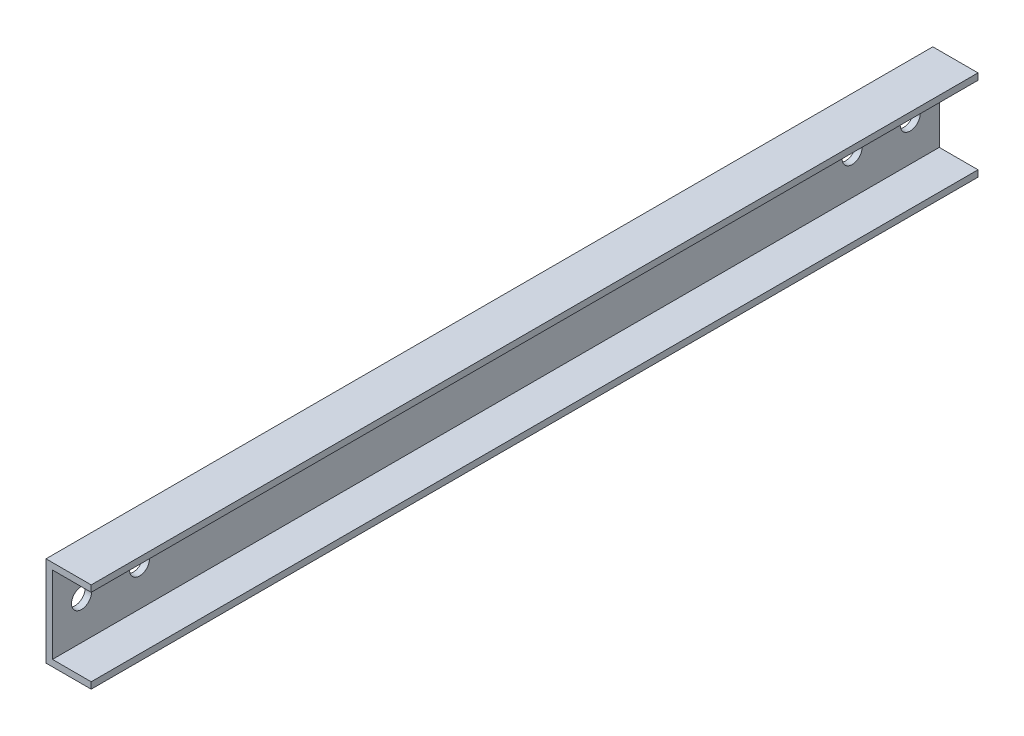
ISO-10303-21;
HEADER;
FILE_DESCRIPTION(('STEP AP214'),'2;1');
FILE_NAME('part.step','',(''),(''),'','','');
FILE_SCHEMA(('AUTOMOTIVE_DESIGN { 1 0 10303 214 1 1 1 1 }'));
ENDSEC;
DATA;
#1=APPLICATION_CONTEXT('core data for automotive mechanical design processes');
#2=APPLICATION_PROTOCOL_DEFINITION('international standard','automotive_design',2000,#1);
#3=PRODUCT_CONTEXT('',#1,'mechanical');
#4=PRODUCT('Part','Part','',(#3));
#5=PRODUCT_RELATED_PRODUCT_CATEGORY('part','',(#4));
#6=PRODUCT_DEFINITION_FORMATION('','',#4);
#7=PRODUCT_DEFINITION_CONTEXT('part definition',#1,'design');
#8=PRODUCT_DEFINITION('design','',#6,#7);
#9=PRODUCT_DEFINITION_SHAPE('','',#8);
#10=(LENGTH_UNIT() NAMED_UNIT(*) SI_UNIT(.MILLI.,.METRE.));
#11=(NAMED_UNIT(*) PLANE_ANGLE_UNIT() SI_UNIT($,.RADIAN.));
#12=(NAMED_UNIT(*) SI_UNIT($,.STERADIAN.) SOLID_ANGLE_UNIT());
#13=UNCERTAINTY_MEASURE_WITH_UNIT(LENGTH_MEASURE(1.E-05),#10,'distance_accuracy_value','');
#14=(GEOMETRIC_REPRESENTATION_CONTEXT(3) GLOBAL_UNCERTAINTY_ASSIGNED_CONTEXT((#13)) GLOBAL_UNIT_ASSIGNED_CONTEXT((#10,
#11,#12)) REPRESENTATION_CONTEXT('',''));
#15=CARTESIAN_POINT('',(0.,0.,0.));
#16=DIRECTION('',(0.,0.,1.));
#17=DIRECTION('',(1.,0.,0.));
#18=AXIS2_PLACEMENT_3D('',#15,#16,#17);
#19=CARTESIAN_POINT('',(0.,-10.,1374.));
#20=DIRECTION('',(-1.,0.,0.));
#21=DIRECTION('',(0.,0.,1.));
#22=AXIS2_PLACEMENT_3D('',#19,#20,#21);
#23=PLANE('',#22);
#24=DIRECTION('',(0.,1.,0.));
#25=VECTOR('',#24,1.);
#26=CARTESIAN_POINT('',(0.,-10.,0.));
#27=LINE('',#26,#25);
#28=CARTESIAN_POINT('',(0.,-10.,0.));
#29=VERTEX_POINT('',#28);
#30=CARTESIAN_POINT('',(0.,0.,0.));
#31=VERTEX_POINT('',#30);
#32=EDGE_CURVE('E128',#29,#31,#27,.T.);
#33=ORIENTED_EDGE('',*,*,#32,.T.);
#34=DIRECTION('',(0.,0.,-1.));
#35=VECTOR('',#34,1.);
#36=CARTESIAN_POINT('',(0.,0.,1374.));
#37=LINE('',#36,#35);
#38=CARTESIAN_POINT('',(0.,0.,1374.));
#39=VERTEX_POINT('',#38);
#40=EDGE_CURVE('E11',#39,#31,#37,.T.);
#41=ORIENTED_EDGE('',*,*,#40,.F.);
#42=DIRECTION('',(0.,1.,0.));
#43=VECTOR('',#42,1.);
#44=CARTESIAN_POINT('',(0.,-10.,1374.));
#45=LINE('',#44,#43);
#46=CARTESIAN_POINT('',(0.,-10.,1374.));
#47=VERTEX_POINT('',#46);
#48=EDGE_CURVE('E143',#47,#39,#45,.T.);
#49=ORIENTED_EDGE('',*,*,#48,.F.);
#50=DIRECTION('',(0.,0.,-1.));
#51=VECTOR('',#50,1.);
#52=CARTESIAN_POINT('',(0.,-10.,1374.));
#53=LINE('',#52,#51);
#54=EDGE_CURVE('E124',#47,#29,#53,.T.);
#55=ORIENTED_EDGE('',*,*,#54,.T.);
#56=EDGE_LOOP('',(#33,#41,#49,#55));
#57=FACE_BOUND('',#56,.T.);
#58=ADVANCED_FACE('F32',(#57),#23,.F.);
#59=CARTESIAN_POINT('',(0.,0.,1374.));
#60=DIRECTION('',(0.,-1.,0.));
#61=DIRECTION('',(1.,0.,0.));
#62=AXIS2_PLACEMENT_3D('',#59,#60,#61);
#63=PLANE('',#62);
#64=DIRECTION('',(-1.,0.,0.));
#65=VECTOR('',#64,1.);
#66=CARTESIAN_POINT('',(0.,0.,0.));
#67=LINE('',#66,#65);
#68=CARTESIAN_POINT('',(-60.,0.,0.));
#69=VERTEX_POINT('',#68);
#70=EDGE_CURVE('E131',#31,#69,#67,.T.);
#71=ORIENTED_EDGE('',*,*,#70,.T.);
#72=DIRECTION('',(0.,0.,-1.));
#73=VECTOR('',#72,1.);
#74=CARTESIAN_POINT('',(-60.,0.,1374.));
#75=LINE('',#74,#73);
#76=CARTESIAN_POINT('',(-60.,0.,1374.));
#77=VERTEX_POINT('',#76);
#78=EDGE_CURVE('E40',#77,#69,#75,.T.);
#79=ORIENTED_EDGE('',*,*,#78,.F.);
#80=DIRECTION('',(-1.,0.,0.));
#81=VECTOR('',#80,1.);
#82=CARTESIAN_POINT('',(0.,0.,1374.));
#83=LINE('',#82,#81);
#84=EDGE_CURVE('E91',#39,#77,#83,.T.);
#85=ORIENTED_EDGE('',*,*,#84,.F.);
#86=ORIENTED_EDGE('',*,*,#40,.T.);
#87=EDGE_LOOP('',(#71,#79,#85,#86));
#88=FACE_BOUND('',#87,.T.);
#89=ADVANCED_FACE('F211',(#88),#63,.F.);
#90=CARTESIAN_POINT('',(-60.,0.,1374.));
#91=DIRECTION('',(-1.,0.,0.));
#92=DIRECTION('',(0.,0.,1.));
#93=AXIS2_PLACEMENT_3D('',#90,#91,#92);
#94=PLANE('',#93);
#95=CARTESIAN_POINT('',(-60.,60.,1329.));
#96=DIRECTION('',(1.,0.,0.));
#97=DIRECTION('',(0.,0.,1.));
#98=AXIS2_PLACEMENT_3D('',#95,#96,#97);
#99=CIRCLE('',#98,15.5000000000002);
#100=CARTESIAN_POINT('',(-60.,60.,1344.5));
#101=VERTEX_POINT('',#100);
#102=EDGE_CURVE('E194',#101,#101,#99,.T.);
#103=ORIENTED_EDGE('',*,*,#102,.F.);
#104=EDGE_LOOP('',(#103));
#105=FACE_BOUND('',#104,.T.);
#106=CARTESIAN_POINT('',(-60.,60.,1239.));
#107=DIRECTION('',(1.,0.,0.));
#108=DIRECTION('',(0.,0.,1.));
#109=AXIS2_PLACEMENT_3D('',#106,#107,#108);
#110=CIRCLE('',#109,15.4999999999997);
#111=CARTESIAN_POINT('',(-60.,60.,1254.5));
#112=VERTEX_POINT('',#111);
#113=EDGE_CURVE('E188',#112,#112,#110,.T.);
#114=ORIENTED_EDGE('',*,*,#113,.F.);
#115=EDGE_LOOP('',(#114));
#116=FACE_BOUND('',#115,.T.);
#117=CARTESIAN_POINT('',(-60.,60.,135.));
#118=DIRECTION('',(1.,0.,0.));
#119=DIRECTION('',(0.,0.,-1.));
#120=AXIS2_PLACEMENT_3D('',#117,#118,#119);
#121=CIRCLE('',#120,15.5);
#122=CARTESIAN_POINT('',(-60.,60.,119.5));
#123=VERTEX_POINT('',#122);
#124=EDGE_CURVE('E182',#123,#123,#121,.T.);
#125=ORIENTED_EDGE('',*,*,#124,.F.);
#126=EDGE_LOOP('',(#125));
#127=FACE_BOUND('',#126,.T.);
#128=CARTESIAN_POINT('',(-60.,60.,45.));
#129=DIRECTION('',(1.,0.,0.));
#130=DIRECTION('',(0.,0.,-1.));
#131=AXIS2_PLACEMENT_3D('',#128,#129,#130);
#132=CIRCLE('',#131,15.5);
#133=CARTESIAN_POINT('',(-60.,60.,29.5));
#134=VERTEX_POINT('',#133);
#135=EDGE_CURVE('E176',#134,#134,#132,.T.);
#136=ORIENTED_EDGE('',*,*,#135,.F.);
#137=EDGE_LOOP('',(#136));
#138=FACE_BOUND('',#137,.T.);
#139=DIRECTION('',(0.,1.,0.));
#140=VECTOR('',#139,1.);
#141=CARTESIAN_POINT('',(-60.,0.,0.));
#142=LINE('',#141,#140);
#143=CARTESIAN_POINT('',(-60.,120.,0.));
#144=VERTEX_POINT('',#143);
#145=EDGE_CURVE('E134',#69,#144,#142,.T.);
#146=ORIENTED_EDGE('',*,*,#145,.T.);
#147=DIRECTION('',(0.,0.,-1.));
#148=VECTOR('',#147,1.);
#149=CARTESIAN_POINT('',(-60.,120.,1374.));
#150=LINE('',#149,#148);
#151=CARTESIAN_POINT('',(-60.,120.,1374.));
#152=VERTEX_POINT('',#151);
#153=EDGE_CURVE('E150',#152,#144,#150,.T.);
#154=ORIENTED_EDGE('',*,*,#153,.F.);
#155=DIRECTION('',(0.,1.,0.));
#156=VECTOR('',#155,1.);
#157=CARTESIAN_POINT('',(-60.,0.,1374.));
#158=LINE('',#157,#156);
#159=EDGE_CURVE('E158',#77,#152,#158,.T.);
#160=ORIENTED_EDGE('',*,*,#159,.F.);
#161=ORIENTED_EDGE('',*,*,#78,.T.);
#162=EDGE_LOOP('',(#146,#154,#160,#161));
#163=FACE_BOUND('',#162,.T.);
#164=ADVANCED_FACE('F156',(#105,#116,#127,#138,#163),#94,.F.);
#165=CARTESIAN_POINT('',(-60.,120.,1374.));
#166=DIRECTION('',(0.,1.,0.));
#167=DIRECTION('',(0.,0.,1.));
#168=AXIS2_PLACEMENT_3D('',#165,#166,#167);
#169=PLANE('',#168);
#170=DIRECTION('',(1.,0.,0.));
#171=VECTOR('',#170,1.);
#172=CARTESIAN_POINT('',(-60.,120.,0.));
#173=LINE('',#172,#171);
#174=CARTESIAN_POINT('',(0.,120.,0.));
#175=VERTEX_POINT('',#174);
#176=EDGE_CURVE('E136',#144,#175,#173,.T.);
#177=ORIENTED_EDGE('',*,*,#176,.T.);
#178=DIRECTION('',(0.,0.,-1.));
#179=VECTOR('',#178,1.);
#180=CARTESIAN_POINT('',(0.,120.,1374.));
#181=LINE('',#180,#179);
#182=CARTESIAN_POINT('',(0.,120.,1374.));
#183=VERTEX_POINT('',#182);
#184=EDGE_CURVE('E147',#183,#175,#181,.T.);
#185=ORIENTED_EDGE('',*,*,#184,.F.);
#186=DIRECTION('',(1.,0.,0.));
#187=VECTOR('',#186,1.);
#188=CARTESIAN_POINT('',(-60.,120.,1374.));
#189=LINE('',#188,#187);
#190=EDGE_CURVE('E170',#152,#183,#189,.T.);
#191=ORIENTED_EDGE('',*,*,#190,.F.);
#192=ORIENTED_EDGE('',*,*,#153,.T.);
#193=EDGE_LOOP('',(#177,#185,#191,#192));
#194=FACE_BOUND('',#193,.T.);
#195=ADVANCED_FACE('F166',(#194),#169,.F.);
#196=CARTESIAN_POINT('',(0.,130.,1374.));
#197=DIRECTION('',(-1.,0.,0.));
#198=DIRECTION('',(0.,0.,1.));
#199=AXIS2_PLACEMENT_3D('',#196,#197,#198);
#200=PLANE('',#199);
#201=DIRECTION('',(0.,1.,0.));
#202=VECTOR('',#201,1.);
#203=CARTESIAN_POINT('',(0.,130.,0.));
#204=LINE('',#203,#202);
#205=CARTESIAN_POINT('',(0.,130.,0.));
#206=VERTEX_POINT('',#205);
#207=EDGE_CURVE('E138',#175,#206,#204,.T.);
#208=ORIENTED_EDGE('',*,*,#207,.T.);
#209=DIRECTION('',(0.,0.,-1.));
#210=VECTOR('',#209,1.);
#211=CARTESIAN_POINT('',(0.,130.,1374.));
#212=LINE('',#211,#210);
#213=CARTESIAN_POINT('',(0.,130.,1374.));
#214=VERTEX_POINT('',#213);
#215=EDGE_CURVE('E119',#214,#206,#212,.T.);
#216=ORIENTED_EDGE('',*,*,#215,.F.);
#217=DIRECTION('',(0.,1.,0.));
#218=VECTOR('',#217,1.);
#219=CARTESIAN_POINT('',(0.,130.,1374.));
#220=LINE('',#219,#218);
#221=EDGE_CURVE('E110',#183,#214,#220,.T.);
#222=ORIENTED_EDGE('',*,*,#221,.F.);
#223=ORIENTED_EDGE('',*,*,#184,.T.);
#224=EDGE_LOOP('',(#208,#216,#222,#223));
#225=FACE_BOUND('',#224,.T.);
#226=ADVANCED_FACE('F169',(#225),#200,.F.);
#227=CARTESIAN_POINT('',(0.,130.,1374.));
#228=DIRECTION('',(0.,-1.,0.));
#229=DIRECTION('',(0.,0.,-1.));
#230=AXIS2_PLACEMENT_3D('',#227,#228,#229);
#231=PLANE('',#230);
#232=DIRECTION('',(-1.,0.,0.));
#233=VECTOR('',#232,1.);
#234=CARTESIAN_POINT('',(0.,130.,0.));
#235=LINE('',#234,#233);
#236=CARTESIAN_POINT('',(-70.,130.,0.));
#237=VERTEX_POINT('',#236);
#238=EDGE_CURVE('E118',#206,#237,#235,.T.);
#239=ORIENTED_EDGE('',*,*,#238,.T.);
#240=DIRECTION('',(0.,0.,-1.));
#241=VECTOR('',#240,1.);
#242=CARTESIAN_POINT('',(-70.,130.,1374.));
#243=LINE('',#242,#241);
#244=CARTESIAN_POINT('',(-70.,130.,1374.));
#245=VERTEX_POINT('',#244);
#246=EDGE_CURVE('E115',#245,#237,#243,.T.);
#247=ORIENTED_EDGE('',*,*,#246,.F.);
#248=DIRECTION('',(-1.,0.,0.));
#249=VECTOR('',#248,1.);
#250=CARTESIAN_POINT('',(0.,130.,1374.));
#251=LINE('',#250,#249);
#252=EDGE_CURVE('E104',#214,#245,#251,.T.);
#253=ORIENTED_EDGE('',*,*,#252,.F.);
#254=ORIENTED_EDGE('',*,*,#215,.T.);
#255=EDGE_LOOP('',(#239,#247,#253,#254));
#256=FACE_BOUND('',#255,.T.);
#257=ADVANCED_FACE('F116',(#256),#231,.F.);
#258=CARTESIAN_POINT('',(-70.,130.,1374.));
#259=DIRECTION('',(1.,0.,0.));
#260=DIRECTION('',(0.,1.,0.));
#261=AXIS2_PLACEMENT_3D('',#258,#259,#260);
#262=PLANE('',#261);
#263=CARTESIAN_POINT('',(-70.,60.,1329.));
#264=DIRECTION('',(1.,0.,0.));
#265=DIRECTION('',(0.,0.,1.));
#266=AXIS2_PLACEMENT_3D('',#263,#264,#265);
#267=CIRCLE('',#266,15.5000000000002);
#268=CARTESIAN_POINT('',(-70.,60.,1344.5));
#269=VERTEX_POINT('',#268);
#270=EDGE_CURVE('E191',#269,#269,#267,.T.);
#271=ORIENTED_EDGE('',*,*,#270,.T.);
#272=EDGE_LOOP('',(#271));
#273=FACE_BOUND('',#272,.T.);
#274=CARTESIAN_POINT('',(-70.,60.,1239.));
#275=DIRECTION('',(1.,0.,0.));
#276=DIRECTION('',(0.,0.,1.));
#277=AXIS2_PLACEMENT_3D('',#274,#275,#276);
#278=CIRCLE('',#277,15.4999999999997);
#279=CARTESIAN_POINT('',(-70.,60.,1254.5));
#280=VERTEX_POINT('',#279);
#281=EDGE_CURVE('E185',#280,#280,#278,.T.);
#282=ORIENTED_EDGE('',*,*,#281,.T.);
#283=EDGE_LOOP('',(#282));
#284=FACE_BOUND('',#283,.T.);
#285=CARTESIAN_POINT('',(-70.,60.,135.));
#286=DIRECTION('',(1.,0.,0.));
#287=DIRECTION('',(0.,0.,-1.));
#288=AXIS2_PLACEMENT_3D('',#285,#286,#287);
#289=CIRCLE('',#288,15.5);
#290=CARTESIAN_POINT('',(-70.,60.,119.5));
#291=VERTEX_POINT('',#290);
#292=EDGE_CURVE('E179',#291,#291,#289,.T.);
#293=ORIENTED_EDGE('',*,*,#292,.T.);
#294=EDGE_LOOP('',(#293));
#295=FACE_BOUND('',#294,.T.);
#296=CARTESIAN_POINT('',(-70.,60.,45.));
#297=DIRECTION('',(1.,0.,0.));
#298=DIRECTION('',(0.,0.,-1.));
#299=AXIS2_PLACEMENT_3D('',#296,#297,#298);
#300=CIRCLE('',#299,15.5);
#301=CARTESIAN_POINT('',(-70.,60.,29.5));
#302=VERTEX_POINT('',#301);
#303=EDGE_CURVE('E132',#302,#302,#300,.T.);
#304=ORIENTED_EDGE('',*,*,#303,.T.);
#305=EDGE_LOOP('',(#304));
#306=FACE_BOUND('',#305,.T.);
#307=DIRECTION('',(0.,-1.,0.));
#308=VECTOR('',#307,1.);
#309=CARTESIAN_POINT('',(-70.,130.,0.));
#310=LINE('',#309,#308);
#311=CARTESIAN_POINT('',(-70.,-10.,0.));
#312=VERTEX_POINT('',#311);
#313=EDGE_CURVE('E77',#237,#312,#310,.T.);
#314=ORIENTED_EDGE('',*,*,#313,.T.);
#315=DIRECTION('',(0.,0.,-1.));
#316=VECTOR('',#315,1.);
#317=CARTESIAN_POINT('',(-70.,-10.,1374.));
#318=LINE('',#317,#316);
#319=CARTESIAN_POINT('',(-70.,-10.,1374.));
#320=VERTEX_POINT('',#319);
#321=EDGE_CURVE('E120',#320,#312,#318,.T.);
#322=ORIENTED_EDGE('',*,*,#321,.F.);
#323=DIRECTION('',(0.,-1.,0.));
#324=VECTOR('',#323,1.);
#325=CARTESIAN_POINT('',(-70.,130.,1374.));
#326=LINE('',#325,#324);
#327=EDGE_CURVE('E108',#245,#320,#326,.T.);
#328=ORIENTED_EDGE('',*,*,#327,.F.);
#329=ORIENTED_EDGE('',*,*,#246,.T.);
#330=EDGE_LOOP('',(#314,#322,#328,#329));
#331=FACE_BOUND('',#330,.T.);
#332=ADVANCED_FACE('F122',(#273,#284,#295,#306,#331),#262,.F.);
#333=CARTESIAN_POINT('',(-70.,-10.,1374.));
#334=DIRECTION('',(0.,1.,0.));
#335=DIRECTION('',(0.,0.,1.));
#336=AXIS2_PLACEMENT_3D('',#333,#334,#335);
#337=PLANE('',#336);
#338=DIRECTION('',(1.,0.,0.));
#339=VECTOR('',#338,1.);
#340=CARTESIAN_POINT('',(-70.,-10.,0.));
#341=LINE('',#340,#339);
#342=EDGE_CURVE('E83',#312,#29,#341,.T.);
#343=ORIENTED_EDGE('',*,*,#342,.T.);
#344=ORIENTED_EDGE('',*,*,#54,.F.);
#345=DIRECTION('',(1.,0.,0.));
#346=VECTOR('',#345,1.);
#347=CARTESIAN_POINT('',(-70.,-10.,1374.));
#348=LINE('',#347,#346);
#349=EDGE_CURVE('E48',#320,#47,#348,.T.);
#350=ORIENTED_EDGE('',*,*,#349,.F.);
#351=ORIENTED_EDGE('',*,*,#321,.T.);
#352=EDGE_LOOP('',(#343,#344,#350,#351));
#353=FACE_BOUND('',#352,.T.);
#354=ADVANCED_FACE('F240',(#353),#337,.F.);
#355=CARTESIAN_POINT('',(0.,0.,1374.));
#356=DIRECTION('',(0.,0.,1.));
#357=DIRECTION('',(1.,0.,0.));
#358=AXIS2_PLACEMENT_3D('',#355,#356,#357);
#359=PLANE('',#358);
#360=ORIENTED_EDGE('',*,*,#48,.T.);
#361=ORIENTED_EDGE('',*,*,#84,.T.);
#362=ORIENTED_EDGE('',*,*,#159,.T.);
#363=ORIENTED_EDGE('',*,*,#190,.T.);
#364=ORIENTED_EDGE('',*,*,#221,.T.);
#365=ORIENTED_EDGE('',*,*,#252,.T.);
#366=ORIENTED_EDGE('',*,*,#327,.T.);
#367=ORIENTED_EDGE('',*,*,#349,.T.);
#368=EDGE_LOOP('',(#360,#361,#362,#363,#364,#365,#366,#367));
#369=FACE_BOUND('',#368,.T.);
#370=ADVANCED_FACE('F106',(#369),#359,.T.);
#371=CARTESIAN_POINT('',(0.,0.,0.));
#372=DIRECTION('',(0.,0.,1.));
#373=DIRECTION('',(1.,0.,0.));
#374=AXIS2_PLACEMENT_3D('',#371,#372,#373);
#375=PLANE('',#374);
#376=ORIENTED_EDGE('',*,*,#32,.F.);
#377=ORIENTED_EDGE('',*,*,#342,.F.);
#378=ORIENTED_EDGE('',*,*,#313,.F.);
#379=ORIENTED_EDGE('',*,*,#238,.F.);
#380=ORIENTED_EDGE('',*,*,#207,.F.);
#381=ORIENTED_EDGE('',*,*,#176,.F.);
#382=ORIENTED_EDGE('',*,*,#145,.F.);
#383=ORIENTED_EDGE('',*,*,#70,.F.);
#384=EDGE_LOOP('',(#376,#377,#378,#379,#380,#381,#382,#383));
#385=FACE_BOUND('',#384,.T.);
#386=ADVANCED_FACE('F162',(#385),#375,.F.);
#387=CARTESIAN_POINT('',(-70.,60.,45.));
#388=DIRECTION('',(1.,0.,0.));
#389=DIRECTION('',(0.,0.,-1.));
#390=AXIS2_PLACEMENT_3D('',#387,#388,#389);
#391=CYLINDRICAL_SURFACE('',#390,15.5);
#392=ORIENTED_EDGE('',*,*,#303,.F.);
#393=EDGE_LOOP('',(#392));
#394=FACE_BOUND('',#393,.T.);
#395=ORIENTED_EDGE('',*,*,#135,.T.);
#396=EDGE_LOOP('',(#395));
#397=FACE_BOUND('',#396,.T.);
#398=ADVANCED_FACE('F219',(#394,#397),#391,.F.);
#399=CARTESIAN_POINT('',(-70.,60.,135.));
#400=DIRECTION('',(1.,0.,0.));
#401=DIRECTION('',(0.,0.,-1.));
#402=AXIS2_PLACEMENT_3D('',#399,#400,#401);
#403=CYLINDRICAL_SURFACE('',#402,15.5);
#404=ORIENTED_EDGE('',*,*,#292,.F.);
#405=EDGE_LOOP('',(#404));
#406=FACE_BOUND('',#405,.T.);
#407=ORIENTED_EDGE('',*,*,#124,.T.);
#408=EDGE_LOOP('',(#407));
#409=FACE_BOUND('',#408,.T.);
#410=ADVANCED_FACE('F221',(#406,#409),#403,.F.);
#411=CARTESIAN_POINT('',(-70.,60.,1239.));
#412=DIRECTION('',(1.,0.,0.));
#413=DIRECTION('',(0.,0.,-1.));
#414=AXIS2_PLACEMENT_3D('',#411,#412,#413);
#415=CYLINDRICAL_SURFACE('',#414,15.4999999999997);
#416=ORIENTED_EDGE('',*,*,#281,.F.);
#417=EDGE_LOOP('',(#416));
#418=FACE_BOUND('',#417,.T.);
#419=ORIENTED_EDGE('',*,*,#113,.T.);
#420=EDGE_LOOP('',(#419));
#421=FACE_BOUND('',#420,.T.);
#422=ADVANCED_FACE('F205',(#418,#421),#415,.F.);
#423=CARTESIAN_POINT('',(-70.,60.,1329.));
#424=DIRECTION('',(1.,0.,0.));
#425=DIRECTION('',(0.,0.,-1.));
#426=AXIS2_PLACEMENT_3D('',#423,#424,#425);
#427=CYLINDRICAL_SURFACE('',#426,15.5000000000002);
#428=ORIENTED_EDGE('',*,*,#270,.F.);
#429=EDGE_LOOP('',(#428));
#430=FACE_BOUND('',#429,.T.);
#431=ORIENTED_EDGE('',*,*,#102,.T.);
#432=EDGE_LOOP('',(#431));
#433=FACE_BOUND('',#432,.T.);
#434=ADVANCED_FACE('F202',(#430,#433),#427,.F.);
#435=CLOSED_SHELL('',(#58,#89,#164,#195,#226,#257,#332,#354,#370,#386,#398,#410,#422,#434));
#436=MANIFOLD_SOLID_BREP('B2',#435);
#437=ADVANCED_BREP_SHAPE_REPRESENTATION('',(#18,#436),#14);
#438=SHAPE_DEFINITION_REPRESENTATION(#9,#437);
ENDSEC;
END-ISO-10303-21;
